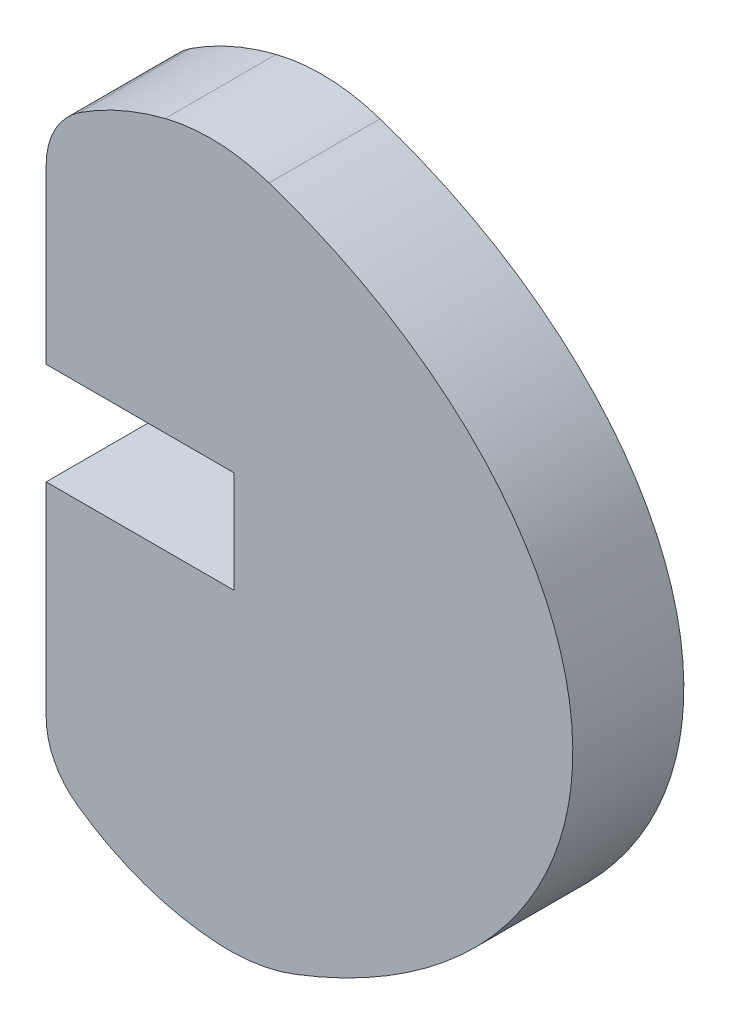
ISO-10303-21;
HEADER;
FILE_DESCRIPTION(('STEP AP214'),'2;1');
FILE_NAME('part.step','',(''),(''),'','','');
FILE_SCHEMA(('AUTOMOTIVE_DESIGN { 1 0 10303 214 1 1 1 1 }'));
ENDSEC;
DATA;
#1=APPLICATION_CONTEXT('core data for automotive mechanical design processes');
#2=APPLICATION_PROTOCOL_DEFINITION('international standard','automotive_design',2000,#1);
#3=PRODUCT_CONTEXT('',#1,'mechanical');
#4=PRODUCT('Part','Part','',(#3));
#5=PRODUCT_RELATED_PRODUCT_CATEGORY('part','',(#4));
#6=PRODUCT_DEFINITION_FORMATION('','',#4);
#7=PRODUCT_DEFINITION_CONTEXT('part definition',#1,'design');
#8=PRODUCT_DEFINITION('design','',#6,#7);
#9=PRODUCT_DEFINITION_SHAPE('','',#8);
#10=(LENGTH_UNIT() NAMED_UNIT(*) SI_UNIT(.MILLI.,.METRE.));
#11=(NAMED_UNIT(*) PLANE_ANGLE_UNIT() SI_UNIT($,.RADIAN.));
#12=(NAMED_UNIT(*) SI_UNIT($,.STERADIAN.) SOLID_ANGLE_UNIT());
#13=UNCERTAINTY_MEASURE_WITH_UNIT(LENGTH_MEASURE(1.E-05),#10,'distance_accuracy_value','');
#14=(GEOMETRIC_REPRESENTATION_CONTEXT(3) GLOBAL_UNCERTAINTY_ASSIGNED_CONTEXT((#13)) GLOBAL_UNIT_ASSIGNED_CONTEXT((#10,
#11,#12)) REPRESENTATION_CONTEXT('',''));
#15=CARTESIAN_POINT('',(0.,0.,0.));
#16=DIRECTION('',(0.,0.,1.));
#17=DIRECTION('',(1.,0.,0.));
#18=AXIS2_PLACEMENT_3D('',#15,#16,#17);
#19=CARTESIAN_POINT('',(-139.359958663416,23.8312896550167,3.));
#20=DIRECTION('',(1.,0.,0.));
#21=DIRECTION('',(0.,1.,0.));
#22=AXIS2_PLACEMENT_3D('',#19,#20,#21);
#23=PLANE('',#22);
#24=DIRECTION('',(0.,-1.,0.));
#25=VECTOR('',#24,1.);
#26=CARTESIAN_POINT('',(-139.359958663416,23.8312896550167,0.));
#27=LINE('',#26,#25);
#28=CARTESIAN_POINT('',(-139.359958663416,23.8312896550167,0.));
#29=VERTEX_POINT('',#28);
#30=CARTESIAN_POINT('',(-139.359958663416,21.0812896550167,0.));
#31=VERTEX_POINT('',#30);
#32=EDGE_CURVE('E168',#29,#31,#27,.T.);
#33=ORIENTED_EDGE('',*,*,#32,.T.);
#34=DIRECTION('',(0.,0.,-1.));
#35=VECTOR('',#34,1.);
#36=CARTESIAN_POINT('',(-139.359958663416,21.0812896550167,3.));
#37=LINE('',#36,#35);
#38=CARTESIAN_POINT('',(-139.359958663416,21.0812896550167,3.));
#39=VERTEX_POINT('',#38);
#40=EDGE_CURVE('E11',#39,#31,#37,.T.);
#41=ORIENTED_EDGE('',*,*,#40,.F.);
#42=DIRECTION('',(0.,-1.,0.));
#43=VECTOR('',#42,1.);
#44=CARTESIAN_POINT('',(-139.359958663416,23.8312896550167,3.));
#45=LINE('',#44,#43);
#46=CARTESIAN_POINT('',(-139.359958663416,23.8312896550167,3.));
#47=VERTEX_POINT('',#46);
#48=EDGE_CURVE('E202',#47,#39,#45,.T.);
#49=ORIENTED_EDGE('',*,*,#48,.F.);
#50=DIRECTION('',(0.,0.,-1.));
#51=VECTOR('',#50,1.);
#52=CARTESIAN_POINT('',(-139.359958663416,23.8312896550167,3.));
#53=LINE('',#52,#51);
#54=EDGE_CURVE('E164',#47,#29,#53,.T.);
#55=ORIENTED_EDGE('',*,*,#54,.T.);
#56=EDGE_LOOP('',(#33,#41,#49,#55));
#57=FACE_BOUND('',#56,.T.);
#58=ADVANCED_FACE('F43',(#57),#23,.F.);
#59=CARTESIAN_POINT('',(-139.359958663416,21.0812896550167,3.));
#60=DIRECTION('',(0.,-1.,0.));
#61=DIRECTION('',(0.,0.,-1.));
#62=AXIS2_PLACEMENT_3D('',#59,#60,#61);
#63=PLANE('',#62);
#64=DIRECTION('',(-1.,0.,0.));
#65=VECTOR('',#64,1.);
#66=CARTESIAN_POINT('',(-139.359958663416,21.0812896550167,0.));
#67=LINE('',#66,#65);
#68=CARTESIAN_POINT('',(-144.434437963302,21.0812896550167,0.));
#69=VERTEX_POINT('',#68);
#70=EDGE_CURVE('E172',#31,#69,#67,.T.);
#71=ORIENTED_EDGE('',*,*,#70,.T.);
#72=DIRECTION('',(0.,0.,-1.));
#73=VECTOR('',#72,1.);
#74=CARTESIAN_POINT('',(-144.434437963302,21.0812896550167,3.));
#75=LINE('',#74,#73);
#76=CARTESIAN_POINT('',(-144.434437963302,21.0812896550167,3.));
#77=VERTEX_POINT('',#76);
#78=EDGE_CURVE('E52',#77,#69,#75,.T.);
#79=ORIENTED_EDGE('',*,*,#78,.F.);
#80=DIRECTION('',(-1.,0.,0.));
#81=VECTOR('',#80,1.);
#82=CARTESIAN_POINT('',(-139.359958663416,21.0812896550167,3.));
#83=LINE('',#82,#81);
#84=EDGE_CURVE('E115',#39,#77,#83,.T.);
#85=ORIENTED_EDGE('',*,*,#84,.F.);
#86=ORIENTED_EDGE('',*,*,#40,.T.);
#87=EDGE_LOOP('',(#71,#79,#85,#86));
#88=FACE_BOUND('',#87,.T.);
#89=ADVANCED_FACE('F288',(#88),#63,.F.);
#90=CARTESIAN_POINT('',(-144.434437963302,21.0812896550167,3.));
#91=DIRECTION('',(1.,0.,0.));
#92=DIRECTION('',(0.,0.,-1.));
#93=AXIS2_PLACEMENT_3D('',#90,#91,#92);
#94=PLANE('',#93);
#95=DIRECTION('',(0.,-1.,0.));
#96=VECTOR('',#95,1.);
#97=CARTESIAN_POINT('',(-144.434437963302,21.0812896550167,0.));
#98=LINE('',#97,#96);
#99=CARTESIAN_POINT('',(-144.434437963302,15.5682664636653,0.));
#100=VERTEX_POINT('',#99);
#101=EDGE_CURVE('E175',#69,#100,#98,.T.);
#102=ORIENTED_EDGE('',*,*,#101,.T.);
#103=DIRECTION('',(0.,0.,-1.));
#104=VECTOR('',#103,1.);
#105=CARTESIAN_POINT('',(-144.434437963302,15.5682664636653,3.));
#106=LINE('',#105,#104);
#107=CARTESIAN_POINT('',(-144.434437963302,15.5682664636653,3.));
#108=VERTEX_POINT('',#107);
#109=EDGE_CURVE('E229',#108,#100,#106,.T.);
#110=ORIENTED_EDGE('',*,*,#109,.F.);
#111=DIRECTION('',(0.,-1.,0.));
#112=VECTOR('',#111,1.);
#113=CARTESIAN_POINT('',(-144.434437963302,21.0812896550167,3.));
#114=LINE('',#113,#112);
#115=EDGE_CURVE('E239',#77,#108,#114,.T.);
#116=ORIENTED_EDGE('',*,*,#115,.F.);
#117=ORIENTED_EDGE('',*,*,#78,.T.);
#118=EDGE_LOOP('',(#102,#110,#116,#117));
#119=FACE_BOUND('',#118,.T.);
#120=ADVANCED_FACE('F237',(#119),#94,.F.);
#121=CARTESIAN_POINT('',(-142.434437963302,15.5682664636653,3.));
#122=DIRECTION('',(0.,0.,-1.));
#123=DIRECTION('',(-1.,0.,0.));
#124=AXIS2_PLACEMENT_3D('',#121,#122,#123);
#125=CYLINDRICAL_SURFACE('',#124,2.00000000000001);
#126=CARTESIAN_POINT('',(-142.434437963302,15.5682664636653,0.));
#127=DIRECTION('',(0.,0.,1.));
#128=DIRECTION('',(-1.,0.,0.));
#129=AXIS2_PLACEMENT_3D('',#126,#127,#128);
#130=CIRCLE('',#129,2.00000000000001);
#131=CARTESIAN_POINT('',(-143.594540450328,13.9391064900601,0.));
#132=VERTEX_POINT('',#131);
#133=EDGE_CURVE('E178',#100,#132,#130,.T.);
#134=ORIENTED_EDGE('',*,*,#133,.T.);
#135=DIRECTION('',(0.,0.,-1.));
#136=VECTOR('',#135,1.);
#137=CARTESIAN_POINT('',(-143.594540450328,13.9391064900601,3.));
#138=LINE('',#137,#136);
#139=CARTESIAN_POINT('',(-143.594540450328,13.9391064900601,3.));
#140=VERTEX_POINT('',#139);
#141=EDGE_CURVE('E225',#140,#132,#138,.T.);
#142=ORIENTED_EDGE('',*,*,#141,.F.);
#143=CARTESIAN_POINT('',(-142.434437963302,15.5682664636653,3.));
#144=DIRECTION('',(0.,0.,1.));
#145=DIRECTION('',(-1.,0.,0.));
#146=AXIS2_PLACEMENT_3D('',#143,#144,#145);
#147=CIRCLE('',#146,2.00000000000001);
#148=EDGE_CURVE('E258',#108,#140,#147,.T.);
#149=ORIENTED_EDGE('',*,*,#148,.F.);
#150=ORIENTED_EDGE('',*,*,#109,.T.);
#151=EDGE_LOOP('',(#134,#142,#149,#150));
#152=FACE_BOUND('',#151,.T.);
#153=ADVANCED_FACE('F248',(#152),#125,.T.);
#154=CARTESIAN_POINT('',(-139.359958663416,19.8858320848663,3.));
#155=DIRECTION('',(0.,0.,-1.));
#156=DIRECTION('',(-1.,0.,0.));
#157=AXIS2_PLACEMENT_3D('',#154,#155,#156);
#158=CYLINDRICAL_SURFACE('',#157,7.30035808779023);
#159=CARTESIAN_POINT('',(-139.359958663416,19.8858320848663,0.));
#160=DIRECTION('',(0.,0.,1.));
#161=DIRECTION('',(1.,0.,0.));
#162=AXIS2_PLACEMENT_3D('',#159,#160,#161);
#163=CIRCLE('',#162,7.30035808779023);
#164=CARTESIAN_POINT('',(-139.790675140374,12.5981910724096,0.));
#165=VERTEX_POINT('',#164);
#166=EDGE_CURVE('E181',#132,#165,#163,.T.);
#167=ORIENTED_EDGE('',*,*,#166,.T.);
#168=DIRECTION('',(0.,0.,-1.));
#169=VECTOR('',#168,1.);
#170=CARTESIAN_POINT('',(-139.790675140374,12.5981910724096,3.));
#171=LINE('',#170,#169);
#172=CARTESIAN_POINT('',(-139.790675140374,12.5981910724096,3.));
#173=VERTEX_POINT('',#172);
#174=EDGE_CURVE('E221',#173,#165,#171,.T.);
#175=ORIENTED_EDGE('',*,*,#174,.F.);
#176=CARTESIAN_POINT('',(-139.359958663416,19.8858320848663,3.));
#177=DIRECTION('',(0.,0.,1.));
#178=DIRECTION('',(1.,0.,0.));
#179=AXIS2_PLACEMENT_3D('',#176,#177,#178);
#180=CIRCLE('',#179,7.30035808779023);
#181=EDGE_CURVE('E254',#140,#173,#180,.T.);
#182=ORIENTED_EDGE('',*,*,#181,.F.);
#183=ORIENTED_EDGE('',*,*,#141,.T.);
#184=EDGE_LOOP('',(#167,#175,#182,#183));
#185=FACE_BOUND('',#184,.T.);
#186=ADVANCED_FACE('F252',(#185),#158,.T.);
#187=CARTESIAN_POINT('',(-139.495678325301,17.5894811740864,3.));
#188=DIRECTION('',(0.,0.,-1.));
#189=DIRECTION('',(-1.,0.,0.));
#190=AXIS2_PLACEMENT_3D('',#187,#188,#189);
#191=CYLINDRICAL_SURFACE('',#190,5.00000000000001);
#192=CARTESIAN_POINT('',(-139.495678325301,17.5894811740864,0.));
#193=DIRECTION('',(0.,0.,1.));
#194=DIRECTION('',(-1.,0.,0.));
#195=AXIS2_PLACEMENT_3D('',#192,#193,#194);
#196=CIRCLE('',#195,5.00000000000001);
#197=CARTESIAN_POINT('',(-137.706379935396,12.9206042993034,0.));
#198=VERTEX_POINT('',#197);
#199=EDGE_CURVE('E184',#165,#198,#196,.T.);
#200=ORIENTED_EDGE('',*,*,#199,.T.);
#201=DIRECTION('',(0.,0.,-1.));
#202=VECTOR('',#201,1.);
#203=CARTESIAN_POINT('',(-137.706379935396,12.9206042993034,3.));
#204=LINE('',#203,#202);
#205=CARTESIAN_POINT('',(-137.706379935396,12.9206042993034,3.));
#206=VERTEX_POINT('',#205);
#207=EDGE_CURVE('E217',#206,#198,#204,.T.);
#208=ORIENTED_EDGE('',*,*,#207,.F.);
#209=CARTESIAN_POINT('',(-139.495678325301,17.5894811740864,3.));
#210=DIRECTION('',(0.,0.,1.));
#211=DIRECTION('',(-1.,0.,0.));
#212=AXIS2_PLACEMENT_3D('',#209,#210,#211);
#213=CIRCLE('',#212,5.00000000000001);
#214=EDGE_CURVE('E257',#173,#206,#213,.T.);
#215=ORIENTED_EDGE('',*,*,#214,.F.);
#216=ORIENTED_EDGE('',*,*,#174,.T.);
#217=EDGE_LOOP('',(#200,#208,#215,#216));
#218=FACE_BOUND('',#217,.T.);
#219=ADVANCED_FACE('F277',(#218),#191,.T.);
#220=CARTESIAN_POINT('',(-144.434437963302,21.8776194144136,3.));
#221=DIRECTION('',(0.,0.,1.));
#222=DIRECTION('',(1.,0.,0.));
#223=AXIS2_PLACEMENT_3D('',#220,#221,#222);
#224=ELLIPSE('',#223,14.2307371411534,10.1648122436809);
#225=DIRECTION('',(0.,0.,-1.));
#226=VECTOR('',#225,1.);
#227=SURFACE_OF_LINEAR_EXTRUSION('',#224,#226);
#228=CARTESIAN_POINT('',(-144.434437963302,21.8776194144136,0.));
#229=DIRECTION('',(0.,0.,1.));
#230=DIRECTION('',(1.,0.,0.));
#231=AXIS2_PLACEMENT_3D('',#228,#229,#230);
#232=ELLIPSE('',#231,14.2307371411534,10.1648122436809);
#233=CARTESIAN_POINT('',(-138.413124464515,31.0876866472648,0.));
#234=VERTEX_POINT('',#233);
#235=EDGE_CURVE('E187',#198,#234,#232,.T.);
#236=ORIENTED_EDGE('',*,*,#235,.T.);
#237=DIRECTION('',(0.,0.,-1.));
#238=VECTOR('',#237,1.);
#239=CARTESIAN_POINT('',(-138.413124464515,31.0876866472648,3.));
#240=LINE('',#239,#238);
#241=CARTESIAN_POINT('',(-138.413124464515,31.0876866472648,3.));
#242=VERTEX_POINT('',#241);
#243=EDGE_CURVE('E213',#242,#234,#240,.T.);
#244=ORIENTED_EDGE('',*,*,#243,.F.);
#245=EDGE_CURVE('E262',#206,#242,#224,.T.);
#246=ORIENTED_EDGE('',*,*,#245,.F.);
#247=ORIENTED_EDGE('',*,*,#207,.T.);
#248=EDGE_LOOP('',(#236,#244,#246,#247));
#249=FACE_BOUND('',#248,.T.);
#250=ADVANCED_FACE('F272',(#249),#227,.F.);
#251=CARTESIAN_POINT('',(-139.995225615036,26.34459103896,3.));
#252=DIRECTION('',(0.,0.,-1.));
#253=DIRECTION('',(-1.,0.,0.));
#254=AXIS2_PLACEMENT_3D('',#251,#252,#253);
#255=CYLINDRICAL_SURFACE('',#254,5.);
#256=CARTESIAN_POINT('',(-139.995225615036,26.34459103896,0.));
#257=DIRECTION('',(0.,0.,1.));
#258=DIRECTION('',(-1.,0.,0.));
#259=AXIS2_PLACEMENT_3D('',#256,#257,#258);
#260=CIRCLE('',#259,5.);
#261=CARTESIAN_POINT('',(-141.220500745332,31.1921368979569,0.));
#262=VERTEX_POINT('',#261);
#263=EDGE_CURVE('E190',#234,#262,#260,.T.);
#264=ORIENTED_EDGE('',*,*,#263,.T.);
#265=DIRECTION('',(0.,0.,-1.));
#266=VECTOR('',#265,1.);
#267=CARTESIAN_POINT('',(-141.220500745332,31.1921368979569,3.));
#268=LINE('',#267,#266);
#269=CARTESIAN_POINT('',(-141.220500745332,31.1921368979569,3.));
#270=VERTEX_POINT('',#269);
#271=EDGE_CURVE('E209',#270,#262,#268,.T.);
#272=ORIENTED_EDGE('',*,*,#271,.F.);
#273=CARTESIAN_POINT('',(-139.995225615036,26.34459103896,3.));
#274=DIRECTION('',(0.,0.,1.));
#275=DIRECTION('',(-1.,0.,0.));
#276=AXIS2_PLACEMENT_3D('',#273,#274,#275);
#277=CIRCLE('',#276,5.);
#278=EDGE_CURVE('E270',#242,#270,#277,.T.);
#279=ORIENTED_EDGE('',*,*,#278,.F.);
#280=ORIENTED_EDGE('',*,*,#243,.T.);
#281=EDGE_LOOP('',(#264,#272,#279,#280));
#282=FACE_BOUND('',#281,.T.);
#283=ADVANCED_FACE('F276',(#282),#255,.T.);
#284=CARTESIAN_POINT('',(-139.359958663416,23.8312896550167,3.));
#285=DIRECTION('',(0.,0.,-1.));
#286=DIRECTION('',(-1.,0.,0.));
#287=AXIS2_PLACEMENT_3D('',#284,#285,#286);
#288=CYLINDRICAL_SURFACE('',#287,7.59234410261295);
#289=CARTESIAN_POINT('',(-139.359958663416,23.8312896550167,0.));
#290=DIRECTION('',(0.,0.,1.));
#291=DIRECTION('',(1.,0.,0.));
#292=AXIS2_PLACEMENT_3D('',#289,#290,#291);
#293=CIRCLE('',#292,7.59234410261295);
#294=CARTESIAN_POINT('',(-143.533969481203,30.1733179319546,0.));
#295=VERTEX_POINT('',#294);
#296=EDGE_CURVE('E193',#262,#295,#293,.T.);
#297=ORIENTED_EDGE('',*,*,#296,.T.);
#298=DIRECTION('',(0.,0.,-1.));
#299=VECTOR('',#298,1.);
#300=CARTESIAN_POINT('',(-143.533969481203,30.1733179319546,3.));
#301=LINE('',#300,#299);
#302=CARTESIAN_POINT('',(-143.533969481203,30.1733179319546,3.));
#303=VERTEX_POINT('',#302);
#304=EDGE_CURVE('E157',#303,#295,#301,.T.);
#305=ORIENTED_EDGE('',*,*,#304,.F.);
#306=CARTESIAN_POINT('',(-139.359958663416,23.8312896550167,3.));
#307=DIRECTION('',(0.,0.,1.));
#308=DIRECTION('',(1.,0.,0.));
#309=AXIS2_PLACEMENT_3D('',#306,#307,#308);
#310=CIRCLE('',#309,7.59234410261295);
#311=EDGE_CURVE('E146',#270,#303,#310,.T.);
#312=ORIENTED_EDGE('',*,*,#311,.F.);
#313=ORIENTED_EDGE('',*,*,#271,.T.);
#314=EDGE_LOOP('',(#297,#305,#312,#313));
#315=FACE_BOUND('',#314,.T.);
#316=ADVANCED_FACE('F300',(#315),#288,.T.);
#317=CARTESIAN_POINT('',(-142.434437963302,28.5026801970934,3.));
#318=DIRECTION('',(0.,0.,-1.));
#319=DIRECTION('',(-1.,0.,0.));
#320=AXIS2_PLACEMENT_3D('',#317,#318,#319);
#321=CYLINDRICAL_SURFACE('',#320,2.00000000000001);
#322=CARTESIAN_POINT('',(-142.434437963302,28.5026801970934,0.));
#323=DIRECTION('',(0.,0.,1.));
#324=DIRECTION('',(-1.,0.,0.));
#325=AXIS2_PLACEMENT_3D('',#322,#323,#324);
#326=CIRCLE('',#325,2.00000000000001);
#327=CARTESIAN_POINT('',(-144.434437963302,28.5026801970934,0.));
#328=VERTEX_POINT('',#327);
#329=EDGE_CURVE('E155',#295,#328,#326,.T.);
#330=ORIENTED_EDGE('',*,*,#329,.T.);
#331=DIRECTION('',(0.,0.,-1.));
#332=VECTOR('',#331,1.);
#333=CARTESIAN_POINT('',(-144.434437963302,28.5026801970934,3.));
#334=LINE('',#333,#332);
#335=CARTESIAN_POINT('',(-144.434437963302,28.5026801970934,3.));
#336=VERTEX_POINT('',#335);
#337=EDGE_CURVE('E152',#336,#328,#334,.T.);
#338=ORIENTED_EDGE('',*,*,#337,.F.);
#339=CARTESIAN_POINT('',(-142.434437963302,28.5026801970934,3.));
#340=DIRECTION('',(0.,0.,1.));
#341=DIRECTION('',(-1.,0.,0.));
#342=AXIS2_PLACEMENT_3D('',#339,#340,#341);
#343=CIRCLE('',#342,2.00000000000001);
#344=EDGE_CURVE('E140',#303,#336,#343,.T.);
#345=ORIENTED_EDGE('',*,*,#344,.F.);
#346=ORIENTED_EDGE('',*,*,#304,.T.);
#347=EDGE_LOOP('',(#330,#338,#345,#346));
#348=FACE_BOUND('',#347,.T.);
#349=ADVANCED_FACE('F153',(#348),#321,.T.);
#350=CARTESIAN_POINT('',(-144.434437963302,23.8312896550167,3.));
#351=DIRECTION('',(1.,0.,0.));
#352=DIRECTION('',(0.,0.,-1.));
#353=AXIS2_PLACEMENT_3D('',#350,#351,#352);
#354=PLANE('',#353);
#355=DIRECTION('',(0.,-1.,0.));
#356=VECTOR('',#355,1.);
#357=CARTESIAN_POINT('',(-144.434437963302,23.8312896550167,0.));
#358=LINE('',#357,#356);
#359=CARTESIAN_POINT('',(-144.434437963302,23.8312896550167,0.));
#360=VERTEX_POINT('',#359);
#361=EDGE_CURVE('E101',#328,#360,#358,.T.);
#362=ORIENTED_EDGE('',*,*,#361,.T.);
#363=DIRECTION('',(0.,0.,-1.));
#364=VECTOR('',#363,1.);
#365=CARTESIAN_POINT('',(-144.434437963302,23.8312896550167,3.));
#366=LINE('',#365,#364);
#367=CARTESIAN_POINT('',(-144.434437963302,23.8312896550167,3.));
#368=VERTEX_POINT('',#367);
#369=EDGE_CURVE('E158',#368,#360,#366,.T.);
#370=ORIENTED_EDGE('',*,*,#369,.F.);
#371=DIRECTION('',(0.,-1.,0.));
#372=VECTOR('',#371,1.);
#373=CARTESIAN_POINT('',(-144.434437963302,23.8312896550167,3.));
#374=LINE('',#373,#372);
#375=EDGE_CURVE('E144',#336,#368,#374,.T.);
#376=ORIENTED_EDGE('',*,*,#375,.F.);
#377=ORIENTED_EDGE('',*,*,#337,.T.);
#378=EDGE_LOOP('',(#362,#370,#376,#377));
#379=FACE_BOUND('',#378,.T.);
#380=ADVANCED_FACE('F160',(#379),#354,.F.);
#381=CARTESIAN_POINT('',(-144.434437963302,23.8312896550167,3.));
#382=DIRECTION('',(0.,1.,0.));
#383=DIRECTION('',(0.,0.,1.));
#384=AXIS2_PLACEMENT_3D('',#381,#382,#383);
#385=PLANE('',#384);
#386=DIRECTION('',(1.,0.,0.));
#387=VECTOR('',#386,1.);
#388=CARTESIAN_POINT('',(-144.434437963302,23.8312896550167,0.));
#389=LINE('',#388,#387);
#390=EDGE_CURVE('E107',#360,#29,#389,.T.);
#391=ORIENTED_EDGE('',*,*,#390,.T.);
#392=ORIENTED_EDGE('',*,*,#54,.F.);
#393=DIRECTION('',(1.,0.,0.));
#394=VECTOR('',#393,1.);
#395=CARTESIAN_POINT('',(-144.434437963302,23.8312896550167,3.));
#396=LINE('',#395,#394);
#397=EDGE_CURVE('E60',#368,#47,#396,.T.);
#398=ORIENTED_EDGE('',*,*,#397,.F.);
#399=ORIENTED_EDGE('',*,*,#369,.T.);
#400=EDGE_LOOP('',(#391,#392,#398,#399));
#401=FACE_BOUND('',#400,.T.);
#402=ADVANCED_FACE('F320',(#401),#385,.F.);
#403=CARTESIAN_POINT('',(-144.434437963302,21.8776194144136,3.));
#404=DIRECTION('',(0.,0.,1.));
#405=DIRECTION('',(1.,0.,0.));
#406=AXIS2_PLACEMENT_3D('',#403,#404,#405);
#407=PLANE('',#406);
#408=ORIENTED_EDGE('',*,*,#48,.T.);
#409=ORIENTED_EDGE('',*,*,#84,.T.);
#410=ORIENTED_EDGE('',*,*,#115,.T.);
#411=ORIENTED_EDGE('',*,*,#148,.T.);
#412=ORIENTED_EDGE('',*,*,#181,.T.);
#413=ORIENTED_EDGE('',*,*,#214,.T.);
#414=ORIENTED_EDGE('',*,*,#245,.T.);
#415=ORIENTED_EDGE('',*,*,#278,.T.);
#416=ORIENTED_EDGE('',*,*,#311,.T.);
#417=ORIENTED_EDGE('',*,*,#344,.T.);
#418=ORIENTED_EDGE('',*,*,#375,.T.);
#419=ORIENTED_EDGE('',*,*,#397,.T.);
#420=EDGE_LOOP('',(#408,#409,#410,#411,#412,#413,#414,#415,#416,#417,#418,#419));
#421=FACE_BOUND('',#420,.T.);
#422=ADVANCED_FACE('F142',(#421),#407,.T.);
#423=CARTESIAN_POINT('',(-144.434437963302,21.8776194144136,0.));
#424=DIRECTION('',(0.,0.,1.));
#425=DIRECTION('',(1.,0.,0.));
#426=AXIS2_PLACEMENT_3D('',#423,#424,#425);
#427=PLANE('',#426);
#428=ORIENTED_EDGE('',*,*,#32,.F.);
#429=ORIENTED_EDGE('',*,*,#390,.F.);
#430=ORIENTED_EDGE('',*,*,#361,.F.);
#431=ORIENTED_EDGE('',*,*,#329,.F.);
#432=ORIENTED_EDGE('',*,*,#296,.F.);
#433=ORIENTED_EDGE('',*,*,#263,.F.);
#434=ORIENTED_EDGE('',*,*,#235,.F.);
#435=ORIENTED_EDGE('',*,*,#199,.F.);
#436=ORIENTED_EDGE('',*,*,#166,.F.);
#437=ORIENTED_EDGE('',*,*,#133,.F.);
#438=ORIENTED_EDGE('',*,*,#101,.F.);
#439=ORIENTED_EDGE('',*,*,#70,.F.);
#440=EDGE_LOOP('',(#428,#429,#430,#431,#432,#433,#434,#435,#436,#437,#438,#439));
#441=FACE_BOUND('',#440,.T.);
#442=ADVANCED_FACE('F243',(#441),#427,.F.);
#443=CLOSED_SHELL('',(#58,#89,#120,#153,#186,#219,#250,#283,#316,#349,#380,#402,#422,#442));
#444=MANIFOLD_SOLID_BREP('B2',#443);
#445=ADVANCED_BREP_SHAPE_REPRESENTATION('',(#18,#444),#14);
#446=SHAPE_DEFINITION_REPRESENTATION(#9,#445);
ENDSEC;
END-ISO-10303-21;
